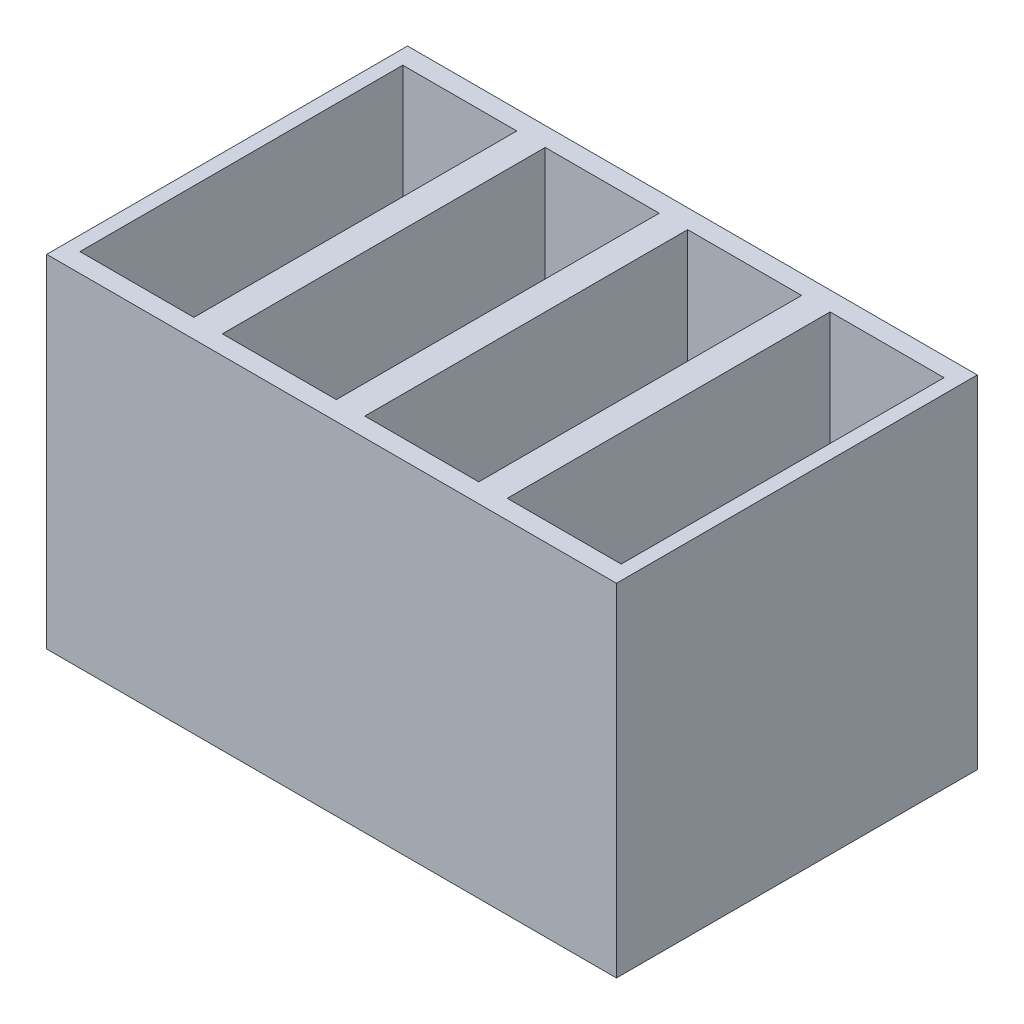
ISO-10303-21;
HEADER;
FILE_DESCRIPTION(('STEP AP214'),'2;1');
FILE_NAME('part.step','',(''),(''),'','','');
FILE_SCHEMA(('AUTOMOTIVE_DESIGN { 1 0 10303 214 1 1 1 1 }'));
ENDSEC;
DATA;
#1=APPLICATION_CONTEXT('core data for automotive mechanical design processes');
#2=APPLICATION_PROTOCOL_DEFINITION('international standard','automotive_design',2000,#1);
#3=PRODUCT_CONTEXT('',#1,'mechanical');
#4=PRODUCT('Part','Part','',(#3));
#5=PRODUCT_RELATED_PRODUCT_CATEGORY('part','',(#4));
#6=PRODUCT_DEFINITION_FORMATION('','',#4);
#7=PRODUCT_DEFINITION_CONTEXT('part definition',#1,'design');
#8=PRODUCT_DEFINITION('design','',#6,#7);
#9=PRODUCT_DEFINITION_SHAPE('','',#8);
#10=(LENGTH_UNIT() NAMED_UNIT(*) SI_UNIT(.MILLI.,.METRE.));
#11=(NAMED_UNIT(*) PLANE_ANGLE_UNIT() SI_UNIT($,.RADIAN.));
#12=(NAMED_UNIT(*) SI_UNIT($,.STERADIAN.) SOLID_ANGLE_UNIT());
#13=UNCERTAINTY_MEASURE_WITH_UNIT(LENGTH_MEASURE(1.E-05),#10,'distance_accuracy_value','');
#14=(GEOMETRIC_REPRESENTATION_CONTEXT(3) GLOBAL_UNCERTAINTY_ASSIGNED_CONTEXT((#13)) GLOBAL_UNIT_ASSIGNED_CONTEXT((#10,
#11,#12)) REPRESENTATION_CONTEXT('',''));
#15=CARTESIAN_POINT('',(0.,0.,0.));
#16=DIRECTION('',(0.,0.,1.));
#17=DIRECTION('',(1.,0.,0.));
#18=AXIS2_PLACEMENT_3D('',#15,#16,#17);
#19=CARTESIAN_POINT('',(0.,914.4,0.));
#20=DIRECTION('',(0.,1.,0.));
#21=DIRECTION('',(0.,0.,-1.));
#22=AXIS2_PLACEMENT_3D('',#19,#20,#21);
#23=PLANE('',#22);
#24=DIRECTION('',(0.,0.,-1.));
#25=VECTOR('',#24,1.);
#26=CARTESIAN_POINT('',(-1828.8,914.4,482.6));
#27=LINE('',#26,#25);
#28=CARTESIAN_POINT('',(-1828.8,914.4,482.6));
#29=VERTEX_POINT('',#28);
#30=CARTESIAN_POINT('',(-1828.8,914.4,-482.6));
#31=VERTEX_POINT('',#30);
#32=EDGE_CURVE('E304',#29,#31,#27,.T.);
#33=ORIENTED_EDGE('',*,*,#32,.F.);
#34=DIRECTION('',(-1.,0.,0.));
#35=VECTOR('',#34,1.);
#36=CARTESIAN_POINT('',(-1828.8,914.4,482.6));
#37=LINE('',#36,#35);
#38=CARTESIAN_POINT('',(-304.8,914.4,482.6));
#39=VERTEX_POINT('',#38);
#40=EDGE_CURVE('E314',#39,#29,#37,.T.);
#41=ORIENTED_EDGE('',*,*,#40,.F.);
#42=DIRECTION('',(0.,0.,1.));
#43=VECTOR('',#42,1.);
#44=CARTESIAN_POINT('',(-304.8,914.4,482.6));
#45=LINE('',#44,#43);
#46=CARTESIAN_POINT('',(-304.8,914.4,-482.6));
#47=VERTEX_POINT('',#46);
#48=EDGE_CURVE('E311',#47,#39,#45,.T.);
#49=ORIENTED_EDGE('',*,*,#48,.F.);
#50=DIRECTION('',(1.,0.,0.));
#51=VECTOR('',#50,1.);
#52=CARTESIAN_POINT('',(-1828.8,914.4,-482.6));
#53=LINE('',#52,#51);
#54=EDGE_CURVE('E307',#31,#47,#53,.T.);
#55=ORIENTED_EDGE('',*,*,#54,.F.);
#56=EDGE_LOOP('',(#33,#41,#49,#55));
#57=FACE_BOUND('',#56,.T.);
#58=DIRECTION('',(1.,0.,0.));
#59=VECTOR('',#58,1.);
#60=CARTESIAN_POINT('',(-1790.7,914.4,-431.8));
#61=LINE('',#60,#59);
#62=CARTESIAN_POINT('',(-1790.7,914.4,-431.8));
#63=VERTEX_POINT('',#62);
#64=CARTESIAN_POINT('',(-1485.9,914.4,-431.8));
#65=VERTEX_POINT('',#64);
#66=EDGE_CURVE('E275',#63,#65,#61,.T.);
#67=ORIENTED_EDGE('',*,*,#66,.T.);
#68=DIRECTION('',(0.,0.,1.));
#69=VECTOR('',#68,1.);
#70=CARTESIAN_POINT('',(-1485.9,914.4,431.8));
#71=LINE('',#70,#69);
#72=CARTESIAN_POINT('',(-1485.9,914.4,431.8));
#73=VERTEX_POINT('',#72);
#74=EDGE_CURVE('E279',#65,#73,#71,.T.);
#75=ORIENTED_EDGE('',*,*,#74,.T.);
#76=DIRECTION('',(-1.,0.,0.));
#77=VECTOR('',#76,1.);
#78=CARTESIAN_POINT('',(-1790.7,914.4,431.8));
#79=LINE('',#78,#77);
#80=CARTESIAN_POINT('',(-1790.7,914.4,431.8));
#81=VERTEX_POINT('',#80);
#82=EDGE_CURVE('E282',#73,#81,#79,.T.);
#83=ORIENTED_EDGE('',*,*,#82,.T.);
#84=DIRECTION('',(0.,0.,-1.));
#85=VECTOR('',#84,1.);
#86=CARTESIAN_POINT('',(-1790.7,914.4,431.8));
#87=LINE('',#86,#85);
#88=EDGE_CURVE('E272',#81,#63,#87,.T.);
#89=ORIENTED_EDGE('',*,*,#88,.T.);
#90=EDGE_LOOP('',(#67,#75,#83,#89));
#91=FACE_BOUND('',#90,.T.);
#92=DIRECTION('',(0.,0.,-1.));
#93=VECTOR('',#92,1.);
#94=CARTESIAN_POINT('',(-1409.7,914.4,431.8));
#95=LINE('',#94,#93);
#96=CARTESIAN_POINT('',(-1409.7,914.4,431.8));
#97=VERTEX_POINT('',#96);
#98=CARTESIAN_POINT('',(-1409.7,914.4,-431.8));
#99=VERTEX_POINT('',#98);
#100=EDGE_CURVE('E243',#97,#99,#95,.T.);
#101=ORIENTED_EDGE('',*,*,#100,.T.);
#102=DIRECTION('',(1.,0.,0.));
#103=VECTOR('',#102,1.);
#104=CARTESIAN_POINT('',(-1409.7,914.4,-431.8));
#105=LINE('',#104,#103);
#106=CARTESIAN_POINT('',(-1104.9,914.4,-431.8));
#107=VERTEX_POINT('',#106);
#108=EDGE_CURVE('E247',#99,#107,#105,.T.);
#109=ORIENTED_EDGE('',*,*,#108,.T.);
#110=DIRECTION('',(0.,0.,1.));
#111=VECTOR('',#110,1.);
#112=CARTESIAN_POINT('',(-1104.9,914.4,431.8));
#113=LINE('',#112,#111);
#114=CARTESIAN_POINT('',(-1104.9,914.4,431.8));
#115=VERTEX_POINT('',#114);
#116=EDGE_CURVE('E250',#107,#115,#113,.T.);
#117=ORIENTED_EDGE('',*,*,#116,.T.);
#118=DIRECTION('',(-1.,0.,0.));
#119=VECTOR('',#118,1.);
#120=CARTESIAN_POINT('',(-1409.7,914.4,431.8));
#121=LINE('',#120,#119);
#122=EDGE_CURVE('E240',#115,#97,#121,.T.);
#123=ORIENTED_EDGE('',*,*,#122,.T.);
#124=EDGE_LOOP('',(#101,#109,#117,#123));
#125=FACE_BOUND('',#124,.T.);
#126=DIRECTION('',(0.,0.,-1.));
#127=VECTOR('',#126,1.);
#128=CARTESIAN_POINT('',(-1028.7,914.4,431.8));
#129=LINE('',#128,#127);
#130=CARTESIAN_POINT('',(-1028.7,914.4,431.8));
#131=VERTEX_POINT('',#130);
#132=CARTESIAN_POINT('',(-1028.7,914.4,-431.8));
#133=VERTEX_POINT('',#132);
#134=EDGE_CURVE('E211',#131,#133,#129,.T.);
#135=ORIENTED_EDGE('',*,*,#134,.T.);
#136=DIRECTION('',(1.,0.,0.));
#137=VECTOR('',#136,1.);
#138=CARTESIAN_POINT('',(-1028.7,914.4,-431.8));
#139=LINE('',#138,#137);
#140=CARTESIAN_POINT('',(-723.9,914.4,-431.8));
#141=VERTEX_POINT('',#140);
#142=EDGE_CURVE('E215',#133,#141,#139,.T.);
#143=ORIENTED_EDGE('',*,*,#142,.T.);
#144=DIRECTION('',(0.,0.,1.));
#145=VECTOR('',#144,1.);
#146=CARTESIAN_POINT('',(-723.9,914.4,431.8));
#147=LINE('',#146,#145);
#148=CARTESIAN_POINT('',(-723.9,914.4,431.8));
#149=VERTEX_POINT('',#148);
#150=EDGE_CURVE('E218',#141,#149,#147,.T.);
#151=ORIENTED_EDGE('',*,*,#150,.T.);
#152=DIRECTION('',(-1.,0.,0.));
#153=VECTOR('',#152,1.);
#154=CARTESIAN_POINT('',(-1028.7,914.4,431.8));
#155=LINE('',#154,#153);
#156=EDGE_CURVE('E208',#149,#131,#155,.T.);
#157=ORIENTED_EDGE('',*,*,#156,.T.);
#158=EDGE_LOOP('',(#135,#143,#151,#157));
#159=FACE_BOUND('',#158,.T.);
#160=DIRECTION('',(0.,0.,-1.));
#161=VECTOR('',#160,1.);
#162=CARTESIAN_POINT('',(-647.7,914.4,431.8));
#163=LINE('',#162,#161);
#164=CARTESIAN_POINT('',(-647.7,914.4,431.8));
#165=VERTEX_POINT('',#164);
#166=CARTESIAN_POINT('',(-647.7,914.4,-431.8));
#167=VERTEX_POINT('',#166);
#168=EDGE_CURVE('E189',#165,#167,#163,.T.);
#169=ORIENTED_EDGE('',*,*,#168,.T.);
#170=DIRECTION('',(1.,0.,0.));
#171=VECTOR('',#170,1.);
#172=CARTESIAN_POINT('',(-647.7,914.4,-431.8));
#173=LINE('',#172,#171);
#174=CARTESIAN_POINT('',(-342.9,914.4,-431.8));
#175=VERTEX_POINT('',#174);
#176=EDGE_CURVE('E194',#167,#175,#173,.T.);
#177=ORIENTED_EDGE('',*,*,#176,.T.);
#178=DIRECTION('',(0.,0.,1.));
#179=VECTOR('',#178,1.);
#180=CARTESIAN_POINT('',(-342.9,914.4,431.8));
#181=LINE('',#180,#179);
#182=CARTESIAN_POINT('',(-342.9,914.4,431.8));
#183=VERTEX_POINT('',#182);
#184=EDGE_CURVE('E190',#175,#183,#181,.T.);
#185=ORIENTED_EDGE('',*,*,#184,.T.);
#186=DIRECTION('',(-1.,0.,0.));
#187=VECTOR('',#186,1.);
#188=CARTESIAN_POINT('',(-647.7,914.4,431.8));
#189=LINE('',#188,#187);
#190=EDGE_CURVE('E175',#183,#165,#189,.T.);
#191=ORIENTED_EDGE('',*,*,#190,.T.);
#192=EDGE_LOOP('',(#169,#177,#185,#191));
#193=FACE_BOUND('',#192,.T.);
#194=ADVANCED_FACE('F37',(#57,#91,#125,#159,#193),#23,.T.);
#195=CARTESIAN_POINT('',(0.,0.,0.));
#196=DIRECTION('',(0.,1.,0.));
#197=DIRECTION('',(0.,0.,-1.));
#198=AXIS2_PLACEMENT_3D('',#195,#196,#197);
#199=PLANE('',#198);
#200=DIRECTION('',(-1.,0.,0.));
#201=VECTOR('',#200,1.);
#202=CARTESIAN_POINT('',(-1028.7,0.,431.8));
#203=LINE('',#202,#201);
#204=CARTESIAN_POINT('',(-723.9,0.,431.8));
#205=VERTEX_POINT('',#204);
#206=CARTESIAN_POINT('',(-1028.7,0.,431.8));
#207=VERTEX_POINT('',#206);
#208=EDGE_CURVE('E183',#205,#207,#203,.T.);
#209=ORIENTED_EDGE('',*,*,#208,.F.);
#210=DIRECTION('',(0.,0.,1.));
#211=VECTOR('',#210,1.);
#212=CARTESIAN_POINT('',(-723.9,0.,431.8));
#213=LINE('',#212,#211);
#214=CARTESIAN_POINT('',(-723.9,0.,-431.8));
#215=VERTEX_POINT('',#214);
#216=EDGE_CURVE('E212',#215,#205,#213,.T.);
#217=ORIENTED_EDGE('',*,*,#216,.F.);
#218=DIRECTION('',(1.,0.,0.));
#219=VECTOR('',#218,1.);
#220=CARTESIAN_POINT('',(-1028.7,0.,-431.8));
#221=LINE('',#220,#219);
#222=CARTESIAN_POINT('',(-1028.7,0.,-431.8));
#223=VERTEX_POINT('',#222);
#224=EDGE_CURVE('E227',#223,#215,#221,.T.);
#225=ORIENTED_EDGE('',*,*,#224,.F.);
#226=DIRECTION('',(0.,0.,-1.));
#227=VECTOR('',#226,1.);
#228=CARTESIAN_POINT('',(-1028.7,0.,431.8));
#229=LINE('',#228,#227);
#230=EDGE_CURVE('E224',#207,#223,#229,.T.);
#231=ORIENTED_EDGE('',*,*,#230,.F.);
#232=EDGE_LOOP('',(#209,#217,#225,#231));
#233=FACE_BOUND('',#232,.T.);
#234=DIRECTION('',(0.,0.,-1.));
#235=VECTOR('',#234,1.);
#236=CARTESIAN_POINT('',(-1790.7,0.,431.8));
#237=LINE('',#236,#235);
#238=CARTESIAN_POINT('',(-1790.7,0.,431.8));
#239=VERTEX_POINT('',#238);
#240=CARTESIAN_POINT('',(-1790.7,0.,-431.8));
#241=VERTEX_POINT('',#240);
#242=EDGE_CURVE('E271',#239,#241,#237,.T.);
#243=ORIENTED_EDGE('',*,*,#242,.F.);
#244=DIRECTION('',(-1.,0.,0.));
#245=VECTOR('',#244,1.);
#246=CARTESIAN_POINT('',(-1790.7,0.,431.8));
#247=LINE('',#246,#245);
#248=CARTESIAN_POINT('',(-1485.9,0.,431.8));
#249=VERTEX_POINT('',#248);
#250=EDGE_CURVE('E276',#249,#239,#247,.T.);
#251=ORIENTED_EDGE('',*,*,#250,.F.);
#252=DIRECTION('',(0.,0.,1.));
#253=VECTOR('',#252,1.);
#254=CARTESIAN_POINT('',(-1485.9,0.,431.8));
#255=LINE('',#254,#253);
#256=CARTESIAN_POINT('',(-1485.9,0.,-431.8));
#257=VERTEX_POINT('',#256);
#258=EDGE_CURVE('E291',#257,#249,#255,.T.);
#259=ORIENTED_EDGE('',*,*,#258,.F.);
#260=DIRECTION('',(1.,0.,0.));
#261=VECTOR('',#260,1.);
#262=CARTESIAN_POINT('',(-1790.7,0.,-431.8));
#263=LINE('',#262,#261);
#264=EDGE_CURVE('E288',#241,#257,#263,.T.);
#265=ORIENTED_EDGE('',*,*,#264,.F.);
#266=EDGE_LOOP('',(#243,#251,#259,#265));
#267=FACE_BOUND('',#266,.T.);
#268=DIRECTION('',(0.,0.,-1.));
#269=VECTOR('',#268,1.);
#270=CARTESIAN_POINT('',(-1828.8,0.,482.6));
#271=LINE('',#270,#269);
#272=CARTESIAN_POINT('',(-1828.8,0.,482.6));
#273=VERTEX_POINT('',#272);
#274=CARTESIAN_POINT('',(-1828.8,0.,-482.6));
#275=VERTEX_POINT('',#274);
#276=EDGE_CURVE('E303',#273,#275,#271,.T.);
#277=ORIENTED_EDGE('',*,*,#276,.T.);
#278=DIRECTION('',(1.,0.,0.));
#279=VECTOR('',#278,1.);
#280=CARTESIAN_POINT('',(-1828.8,0.,-482.6));
#281=LINE('',#280,#279);
#282=CARTESIAN_POINT('',(-304.8,0.,-482.6));
#283=VERTEX_POINT('',#282);
#284=EDGE_CURVE('E320',#275,#283,#281,.T.);
#285=ORIENTED_EDGE('',*,*,#284,.T.);
#286=DIRECTION('',(0.,0.,1.));
#287=VECTOR('',#286,1.);
#288=CARTESIAN_POINT('',(-304.8,0.,482.6));
#289=LINE('',#288,#287);
#290=CARTESIAN_POINT('',(-304.8,0.,482.6));
#291=VERTEX_POINT('',#290);
#292=EDGE_CURVE('E323',#283,#291,#289,.T.);
#293=ORIENTED_EDGE('',*,*,#292,.T.);
#294=DIRECTION('',(-1.,0.,0.));
#295=VECTOR('',#294,1.);
#296=CARTESIAN_POINT('',(-1828.8,0.,482.6));
#297=LINE('',#296,#295);
#298=EDGE_CURVE('E308',#291,#273,#297,.T.);
#299=ORIENTED_EDGE('',*,*,#298,.T.);
#300=EDGE_LOOP('',(#277,#285,#293,#299));
#301=FACE_BOUND('',#300,.T.);
#302=DIRECTION('',(-1.,0.,0.));
#303=VECTOR('',#302,1.);
#304=CARTESIAN_POINT('',(-1409.7,0.,431.8));
#305=LINE('',#304,#303);
#306=CARTESIAN_POINT('',(-1104.9,0.,431.8));
#307=VERTEX_POINT('',#306);
#308=CARTESIAN_POINT('',(-1409.7,0.,431.8));
#309=VERTEX_POINT('',#308);
#310=EDGE_CURVE('E239',#307,#309,#305,.T.);
#311=ORIENTED_EDGE('',*,*,#310,.F.);
#312=DIRECTION('',(0.,0.,1.));
#313=VECTOR('',#312,1.);
#314=CARTESIAN_POINT('',(-1104.9,0.,431.8));
#315=LINE('',#314,#313);
#316=CARTESIAN_POINT('',(-1104.9,0.,-431.8));
#317=VERTEX_POINT('',#316);
#318=EDGE_CURVE('E244',#317,#307,#315,.T.);
#319=ORIENTED_EDGE('',*,*,#318,.F.);
#320=DIRECTION('',(1.,0.,0.));
#321=VECTOR('',#320,1.);
#322=CARTESIAN_POINT('',(-1409.7,0.,-431.8));
#323=LINE('',#322,#321);
#324=CARTESIAN_POINT('',(-1409.7,0.,-431.8));
#325=VERTEX_POINT('',#324);
#326=EDGE_CURVE('E259',#325,#317,#323,.T.);
#327=ORIENTED_EDGE('',*,*,#326,.F.);
#328=DIRECTION('',(0.,0.,-1.));
#329=VECTOR('',#328,1.);
#330=CARTESIAN_POINT('',(-1409.7,0.,431.8));
#331=LINE('',#330,#329);
#332=EDGE_CURVE('E256',#309,#325,#331,.T.);
#333=ORIENTED_EDGE('',*,*,#332,.F.);
#334=EDGE_LOOP('',(#311,#319,#327,#333));
#335=FACE_BOUND('',#334,.T.);
#336=DIRECTION('',(-1.,0.,0.));
#337=VECTOR('',#336,1.);
#338=CARTESIAN_POINT('',(-647.7,0.,431.8));
#339=LINE('',#338,#337);
#340=CARTESIAN_POINT('',(-342.9,0.,431.8));
#341=VERTEX_POINT('',#340);
#342=CARTESIAN_POINT('',(-647.7,0.,431.8));
#343=VERTEX_POINT('',#342);
#344=EDGE_CURVE('E178',#341,#343,#339,.T.);
#345=ORIENTED_EDGE('',*,*,#344,.F.);
#346=DIRECTION('',(0.,0.,1.));
#347=VECTOR('',#346,1.);
#348=CARTESIAN_POINT('',(-342.9,0.,431.8));
#349=LINE('',#348,#347);
#350=CARTESIAN_POINT('',(-342.9,0.,-431.8));
#351=VERTEX_POINT('',#350);
#352=EDGE_CURVE('E191',#351,#341,#349,.T.);
#353=ORIENTED_EDGE('',*,*,#352,.F.);
#354=DIRECTION('',(1.,0.,0.));
#355=VECTOR('',#354,1.);
#356=CARTESIAN_POINT('',(-647.7,0.,-431.8));
#357=LINE('',#356,#355);
#358=CARTESIAN_POINT('',(-647.7,0.,-431.8));
#359=VERTEX_POINT('',#358);
#360=EDGE_CURVE('E202',#359,#351,#357,.T.);
#361=ORIENTED_EDGE('',*,*,#360,.F.);
#362=DIRECTION('',(0.,0.,-1.));
#363=VECTOR('',#362,1.);
#364=CARTESIAN_POINT('',(-647.7,0.,431.8));
#365=LINE('',#364,#363);
#366=EDGE_CURVE('E200',#343,#359,#365,.T.);
#367=ORIENTED_EDGE('',*,*,#366,.F.);
#368=EDGE_LOOP('',(#345,#353,#361,#367));
#369=FACE_BOUND('',#368,.T.);
#370=ADVANCED_FACE('F340',(#233,#267,#301,#335,#369),#199,.F.);
#371=CARTESIAN_POINT('',(-1828.8,914.4,482.6));
#372=DIRECTION('',(1.,0.,0.));
#373=DIRECTION('',(0.,0.,1.));
#374=AXIS2_PLACEMENT_3D('',#371,#372,#373);
#375=PLANE('',#374);
#376=ORIENTED_EDGE('',*,*,#276,.F.);
#377=DIRECTION('',(0.,-1.,0.));
#378=VECTOR('',#377,1.);
#379=CARTESIAN_POINT('',(-1828.8,914.4,482.6));
#380=LINE('',#379,#378);
#381=EDGE_CURVE('E317',#29,#273,#380,.T.);
#382=ORIENTED_EDGE('',*,*,#381,.F.);
#383=ORIENTED_EDGE('',*,*,#32,.T.);
#384=DIRECTION('',(0.,-1.,0.));
#385=VECTOR('',#384,1.);
#386=CARTESIAN_POINT('',(-1828.8,914.4,-482.6));
#387=LINE('',#386,#385);
#388=EDGE_CURVE('E11',#31,#275,#387,.T.);
#389=ORIENTED_EDGE('',*,*,#388,.T.);
#390=EDGE_LOOP('',(#376,#382,#383,#389));
#391=FACE_BOUND('',#390,.T.);
#392=ADVANCED_FACE('F39',(#391),#375,.F.);
#393=CARTESIAN_POINT('',(-1828.8,914.4,-482.6));
#394=DIRECTION('',(0.,0.,1.));
#395=DIRECTION('',(-1.,0.,0.));
#396=AXIS2_PLACEMENT_3D('',#393,#394,#395);
#397=PLANE('',#396);
#398=ORIENTED_EDGE('',*,*,#284,.F.);
#399=ORIENTED_EDGE('',*,*,#388,.F.);
#400=ORIENTED_EDGE('',*,*,#54,.T.);
#401=DIRECTION('',(0.,-1.,0.));
#402=VECTOR('',#401,1.);
#403=CARTESIAN_POINT('',(-304.8,914.4,-482.6));
#404=LINE('',#403,#402);
#405=EDGE_CURVE('E45',#47,#283,#404,.T.);
#406=ORIENTED_EDGE('',*,*,#405,.T.);
#407=EDGE_LOOP('',(#398,#399,#400,#406));
#408=FACE_BOUND('',#407,.T.);
#409=ADVANCED_FACE('F333',(#408),#397,.F.);
#410=CARTESIAN_POINT('',(-304.8,914.4,482.6));
#411=DIRECTION('',(-1.,0.,0.));
#412=DIRECTION('',(0.,0.,-1.));
#413=AXIS2_PLACEMENT_3D('',#410,#411,#412);
#414=PLANE('',#413);
#415=ORIENTED_EDGE('',*,*,#292,.F.);
#416=ORIENTED_EDGE('',*,*,#405,.F.);
#417=ORIENTED_EDGE('',*,*,#48,.T.);
#418=DIRECTION('',(0.,-1.,0.));
#419=VECTOR('',#418,1.);
#420=CARTESIAN_POINT('',(-304.8,914.4,482.6));
#421=LINE('',#420,#419);
#422=EDGE_CURVE('E329',#39,#291,#421,.T.);
#423=ORIENTED_EDGE('',*,*,#422,.T.);
#424=EDGE_LOOP('',(#415,#416,#417,#423));
#425=FACE_BOUND('',#424,.T.);
#426=ADVANCED_FACE('F337',(#425),#414,.F.);
#427=CARTESIAN_POINT('',(-1828.8,914.4,482.6));
#428=DIRECTION('',(0.,0.,-1.));
#429=DIRECTION('',(1.,0.,0.));
#430=AXIS2_PLACEMENT_3D('',#427,#428,#429);
#431=PLANE('',#430);
#432=ORIENTED_EDGE('',*,*,#298,.F.);
#433=ORIENTED_EDGE('',*,*,#422,.F.);
#434=ORIENTED_EDGE('',*,*,#40,.T.);
#435=ORIENTED_EDGE('',*,*,#381,.T.);
#436=EDGE_LOOP('',(#432,#433,#434,#435));
#437=FACE_BOUND('',#436,.T.);
#438=ADVANCED_FACE('F349',(#437),#431,.F.);
#439=CARTESIAN_POINT('',(-1790.7,914.4,431.8));
#440=DIRECTION('',(1.,0.,0.));
#441=DIRECTION('',(0.,0.,1.));
#442=AXIS2_PLACEMENT_3D('',#439,#440,#441);
#443=PLANE('',#442);
#444=ORIENTED_EDGE('',*,*,#242,.T.);
#445=DIRECTION('',(0.,-1.,0.));
#446=VECTOR('',#445,1.);
#447=CARTESIAN_POINT('',(-1790.7,914.4,-431.8));
#448=LINE('',#447,#446);
#449=EDGE_CURVE('E301',#63,#241,#448,.T.);
#450=ORIENTED_EDGE('',*,*,#449,.F.);
#451=ORIENTED_EDGE('',*,*,#88,.F.);
#452=DIRECTION('',(0.,-1.,0.));
#453=VECTOR('',#452,1.);
#454=CARTESIAN_POINT('',(-1790.7,914.4,431.8));
#455=LINE('',#454,#453);
#456=EDGE_CURVE('E285',#81,#239,#455,.T.);
#457=ORIENTED_EDGE('',*,*,#456,.T.);
#458=EDGE_LOOP('',(#444,#450,#451,#457));
#459=FACE_BOUND('',#458,.T.);
#460=ADVANCED_FACE('F351',(#459),#443,.T.);
#461=CARTESIAN_POINT('',(-1790.7,914.4,-431.8));
#462=DIRECTION('',(0.,0.,1.));
#463=DIRECTION('',(-1.,0.,0.));
#464=AXIS2_PLACEMENT_3D('',#461,#462,#463);
#465=PLANE('',#464);
#466=ORIENTED_EDGE('',*,*,#264,.T.);
#467=DIRECTION('',(0.,-1.,0.));
#468=VECTOR('',#467,1.);
#469=CARTESIAN_POINT('',(-1485.9,914.4,-431.8));
#470=LINE('',#469,#468);
#471=EDGE_CURVE('E299',#65,#257,#470,.T.);
#472=ORIENTED_EDGE('',*,*,#471,.F.);
#473=ORIENTED_EDGE('',*,*,#66,.F.);
#474=ORIENTED_EDGE('',*,*,#449,.T.);
#475=EDGE_LOOP('',(#466,#472,#473,#474));
#476=FACE_BOUND('',#475,.T.);
#477=ADVANCED_FACE('F357',(#476),#465,.T.);
#478=CARTESIAN_POINT('',(-1485.9,914.4,431.8));
#479=DIRECTION('',(-1.,0.,0.));
#480=DIRECTION('',(0.,0.,-1.));
#481=AXIS2_PLACEMENT_3D('',#478,#479,#480);
#482=PLANE('',#481);
#483=ORIENTED_EDGE('',*,*,#258,.T.);
#484=DIRECTION('',(0.,-1.,0.));
#485=VECTOR('',#484,1.);
#486=CARTESIAN_POINT('',(-1485.9,914.4,431.8));
#487=LINE('',#486,#485);
#488=EDGE_CURVE('E297',#73,#249,#487,.T.);
#489=ORIENTED_EDGE('',*,*,#488,.F.);
#490=ORIENTED_EDGE('',*,*,#74,.F.);
#491=ORIENTED_EDGE('',*,*,#471,.T.);
#492=EDGE_LOOP('',(#483,#489,#490,#491));
#493=FACE_BOUND('',#492,.T.);
#494=ADVANCED_FACE('F371',(#493),#482,.T.);
#495=CARTESIAN_POINT('',(-1790.7,914.4,431.8));
#496=DIRECTION('',(0.,0.,-1.));
#497=DIRECTION('',(1.,0.,0.));
#498=AXIS2_PLACEMENT_3D('',#495,#496,#497);
#499=PLANE('',#498);
#500=ORIENTED_EDGE('',*,*,#250,.T.);
#501=ORIENTED_EDGE('',*,*,#456,.F.);
#502=ORIENTED_EDGE('',*,*,#82,.F.);
#503=ORIENTED_EDGE('',*,*,#488,.T.);
#504=EDGE_LOOP('',(#500,#501,#502,#503));
#505=FACE_BOUND('',#504,.T.);
#506=ADVANCED_FACE('F375',(#505),#499,.T.);
#507=CARTESIAN_POINT('',(-1409.7,914.4,431.8));
#508=DIRECTION('',(0.,0.,-1.));
#509=DIRECTION('',(1.,0.,0.));
#510=AXIS2_PLACEMENT_3D('',#507,#508,#509);
#511=PLANE('',#510);
#512=ORIENTED_EDGE('',*,*,#310,.T.);
#513=DIRECTION('',(0.,-1.,0.));
#514=VECTOR('',#513,1.);
#515=CARTESIAN_POINT('',(-1409.7,914.4,431.8));
#516=LINE('',#515,#514);
#517=EDGE_CURVE('E269',#97,#309,#516,.T.);
#518=ORIENTED_EDGE('',*,*,#517,.F.);
#519=ORIENTED_EDGE('',*,*,#122,.F.);
#520=DIRECTION('',(0.,-1.,0.));
#521=VECTOR('',#520,1.);
#522=CARTESIAN_POINT('',(-1104.9,914.4,431.8));
#523=LINE('',#522,#521);
#524=EDGE_CURVE('E253',#115,#307,#523,.T.);
#525=ORIENTED_EDGE('',*,*,#524,.T.);
#526=EDGE_LOOP('',(#512,#518,#519,#525));
#527=FACE_BOUND('',#526,.T.);
#528=ADVANCED_FACE('F379',(#527),#511,.T.);
#529=CARTESIAN_POINT('',(-1409.7,914.4,431.8));
#530=DIRECTION('',(1.,0.,0.));
#531=DIRECTION('',(0.,0.,1.));
#532=AXIS2_PLACEMENT_3D('',#529,#530,#531);
#533=PLANE('',#532);
#534=ORIENTED_EDGE('',*,*,#332,.T.);
#535=DIRECTION('',(0.,-1.,0.));
#536=VECTOR('',#535,1.);
#537=CARTESIAN_POINT('',(-1409.7,914.4,-431.8));
#538=LINE('',#537,#536);
#539=EDGE_CURVE('E267',#99,#325,#538,.T.);
#540=ORIENTED_EDGE('',*,*,#539,.F.);
#541=ORIENTED_EDGE('',*,*,#100,.F.);
#542=ORIENTED_EDGE('',*,*,#517,.T.);
#543=EDGE_LOOP('',(#534,#540,#541,#542));
#544=FACE_BOUND('',#543,.T.);
#545=ADVANCED_FACE('F383',(#544),#533,.T.);
#546=CARTESIAN_POINT('',(-1409.7,914.4,-431.8));
#547=DIRECTION('',(0.,0.,1.));
#548=DIRECTION('',(-1.,0.,0.));
#549=AXIS2_PLACEMENT_3D('',#546,#547,#548);
#550=PLANE('',#549);
#551=ORIENTED_EDGE('',*,*,#326,.T.);
#552=DIRECTION('',(0.,-1.,0.));
#553=VECTOR('',#552,1.);
#554=CARTESIAN_POINT('',(-1104.9,914.4,-431.8));
#555=LINE('',#554,#553);
#556=EDGE_CURVE('E265',#107,#317,#555,.T.);
#557=ORIENTED_EDGE('',*,*,#556,.F.);
#558=ORIENTED_EDGE('',*,*,#108,.F.);
#559=ORIENTED_EDGE('',*,*,#539,.T.);
#560=EDGE_LOOP('',(#551,#557,#558,#559));
#561=FACE_BOUND('',#560,.T.);
#562=ADVANCED_FACE('F387',(#561),#550,.T.);
#563=CARTESIAN_POINT('',(-1104.9,914.4,431.8));
#564=DIRECTION('',(-1.,0.,0.));
#565=DIRECTION('',(0.,0.,-1.));
#566=AXIS2_PLACEMENT_3D('',#563,#564,#565);
#567=PLANE('',#566);
#568=ORIENTED_EDGE('',*,*,#318,.T.);
#569=ORIENTED_EDGE('',*,*,#524,.F.);
#570=ORIENTED_EDGE('',*,*,#116,.F.);
#571=ORIENTED_EDGE('',*,*,#556,.T.);
#572=EDGE_LOOP('',(#568,#569,#570,#571));
#573=FACE_BOUND('',#572,.T.);
#574=ADVANCED_FACE('F391',(#573),#567,.T.);
#575=CARTESIAN_POINT('',(-1028.7,914.4,431.8));
#576=DIRECTION('',(0.,0.,-1.));
#577=DIRECTION('',(1.,0.,0.));
#578=AXIS2_PLACEMENT_3D('',#575,#576,#577);
#579=PLANE('',#578);
#580=ORIENTED_EDGE('',*,*,#208,.T.);
#581=DIRECTION('',(0.,-1.,0.));
#582=VECTOR('',#581,1.);
#583=CARTESIAN_POINT('',(-1028.7,914.4,431.8));
#584=LINE('',#583,#582);
#585=EDGE_CURVE('E237',#131,#207,#584,.T.);
#586=ORIENTED_EDGE('',*,*,#585,.F.);
#587=ORIENTED_EDGE('',*,*,#156,.F.);
#588=DIRECTION('',(0.,-1.,0.));
#589=VECTOR('',#588,1.);
#590=CARTESIAN_POINT('',(-723.9,914.4,431.8));
#591=LINE('',#590,#589);
#592=EDGE_CURVE('E221',#149,#205,#591,.T.);
#593=ORIENTED_EDGE('',*,*,#592,.T.);
#594=EDGE_LOOP('',(#580,#586,#587,#593));
#595=FACE_BOUND('',#594,.T.);
#596=ADVANCED_FACE('F395',(#595),#579,.T.);
#597=CARTESIAN_POINT('',(-1028.7,914.4,431.8));
#598=DIRECTION('',(1.,0.,0.));
#599=DIRECTION('',(0.,0.,1.));
#600=AXIS2_PLACEMENT_3D('',#597,#598,#599);
#601=PLANE('',#600);
#602=ORIENTED_EDGE('',*,*,#230,.T.);
#603=DIRECTION('',(0.,-1.,0.));
#604=VECTOR('',#603,1.);
#605=CARTESIAN_POINT('',(-1028.7,914.4,-431.8));
#606=LINE('',#605,#604);
#607=EDGE_CURVE('E235',#133,#223,#606,.T.);
#608=ORIENTED_EDGE('',*,*,#607,.F.);
#609=ORIENTED_EDGE('',*,*,#134,.F.);
#610=ORIENTED_EDGE('',*,*,#585,.T.);
#611=EDGE_LOOP('',(#602,#608,#609,#610));
#612=FACE_BOUND('',#611,.T.);
#613=ADVANCED_FACE('F399',(#612),#601,.T.);
#614=CARTESIAN_POINT('',(-1028.7,914.4,-431.8));
#615=DIRECTION('',(0.,0.,1.));
#616=DIRECTION('',(-1.,0.,0.));
#617=AXIS2_PLACEMENT_3D('',#614,#615,#616);
#618=PLANE('',#617);
#619=ORIENTED_EDGE('',*,*,#224,.T.);
#620=DIRECTION('',(0.,-1.,0.));
#621=VECTOR('',#620,1.);
#622=CARTESIAN_POINT('',(-723.9,914.4,-431.8));
#623=LINE('',#622,#621);
#624=EDGE_CURVE('E233',#141,#215,#623,.T.);
#625=ORIENTED_EDGE('',*,*,#624,.F.);
#626=ORIENTED_EDGE('',*,*,#142,.F.);
#627=ORIENTED_EDGE('',*,*,#607,.T.);
#628=EDGE_LOOP('',(#619,#625,#626,#627));
#629=FACE_BOUND('',#628,.T.);
#630=ADVANCED_FACE('F403',(#629),#618,.T.);
#631=CARTESIAN_POINT('',(-723.9,914.4,431.8));
#632=DIRECTION('',(-1.,0.,0.));
#633=DIRECTION('',(0.,0.,-1.));
#634=AXIS2_PLACEMENT_3D('',#631,#632,#633);
#635=PLANE('',#634);
#636=ORIENTED_EDGE('',*,*,#216,.T.);
#637=ORIENTED_EDGE('',*,*,#592,.F.);
#638=ORIENTED_EDGE('',*,*,#150,.F.);
#639=ORIENTED_EDGE('',*,*,#624,.T.);
#640=EDGE_LOOP('',(#636,#637,#638,#639));
#641=FACE_BOUND('',#640,.T.);
#642=ADVANCED_FACE('F407',(#641),#635,.T.);
#643=CARTESIAN_POINT('',(-647.7,914.4,431.8));
#644=DIRECTION('',(0.,0.,-1.));
#645=DIRECTION('',(1.,0.,0.));
#646=AXIS2_PLACEMENT_3D('',#643,#644,#645);
#647=PLANE('',#646);
#648=ORIENTED_EDGE('',*,*,#344,.T.);
#649=DIRECTION('',(0.,-1.,0.));
#650=VECTOR('',#649,1.);
#651=CARTESIAN_POINT('',(-647.7,914.4,431.8));
#652=LINE('',#651,#650);
#653=EDGE_CURVE('E172',#165,#343,#652,.T.);
#654=ORIENTED_EDGE('',*,*,#653,.F.);
#655=ORIENTED_EDGE('',*,*,#190,.F.);
#656=DIRECTION('',(0.,-1.,0.));
#657=VECTOR('',#656,1.);
#658=CARTESIAN_POINT('',(-342.9,914.4,431.8));
#659=LINE('',#658,#657);
#660=EDGE_CURVE('E60',#183,#341,#659,.T.);
#661=ORIENTED_EDGE('',*,*,#660,.T.);
#662=EDGE_LOOP('',(#648,#654,#655,#661));
#663=FACE_BOUND('',#662,.T.);
#664=ADVANCED_FACE('F174',(#663),#647,.T.);
#665=CARTESIAN_POINT('',(-647.7,914.4,431.8));
#666=DIRECTION('',(1.,0.,0.));
#667=DIRECTION('',(0.,0.,1.));
#668=AXIS2_PLACEMENT_3D('',#665,#666,#667);
#669=PLANE('',#668);
#670=ORIENTED_EDGE('',*,*,#366,.T.);
#671=DIRECTION('',(0.,-1.,0.));
#672=VECTOR('',#671,1.);
#673=CARTESIAN_POINT('',(-647.7,914.4,-431.8));
#674=LINE('',#673,#672);
#675=EDGE_CURVE('E184',#167,#359,#674,.T.);
#676=ORIENTED_EDGE('',*,*,#675,.F.);
#677=ORIENTED_EDGE('',*,*,#168,.F.);
#678=ORIENTED_EDGE('',*,*,#653,.T.);
#679=EDGE_LOOP('',(#670,#676,#677,#678));
#680=FACE_BOUND('',#679,.T.);
#681=ADVANCED_FACE('F193',(#680),#669,.T.);
#682=CARTESIAN_POINT('',(-647.7,914.4,-431.8));
#683=DIRECTION('',(0.,0.,1.));
#684=DIRECTION('',(-1.,0.,0.));
#685=AXIS2_PLACEMENT_3D('',#682,#683,#684);
#686=PLANE('',#685);
#687=ORIENTED_EDGE('',*,*,#360,.T.);
#688=DIRECTION('',(0.,-1.,0.));
#689=VECTOR('',#688,1.);
#690=CARTESIAN_POINT('',(-342.9,914.4,-431.8));
#691=LINE('',#690,#689);
#692=EDGE_CURVE('E52',#175,#351,#691,.T.);
#693=ORIENTED_EDGE('',*,*,#692,.F.);
#694=ORIENTED_EDGE('',*,*,#176,.F.);
#695=ORIENTED_EDGE('',*,*,#675,.T.);
#696=EDGE_LOOP('',(#687,#693,#694,#695));
#697=FACE_BOUND('',#696,.T.);
#698=ADVANCED_FACE('F416',(#697),#686,.T.);
#699=CARTESIAN_POINT('',(-342.9,914.4,431.8));
#700=DIRECTION('',(-1.,0.,0.));
#701=DIRECTION('',(0.,0.,-1.));
#702=AXIS2_PLACEMENT_3D('',#699,#700,#701);
#703=PLANE('',#702);
#704=ORIENTED_EDGE('',*,*,#352,.T.);
#705=ORIENTED_EDGE('',*,*,#660,.F.);
#706=ORIENTED_EDGE('',*,*,#184,.F.);
#707=ORIENTED_EDGE('',*,*,#692,.T.);
#708=EDGE_LOOP('',(#704,#705,#706,#707));
#709=FACE_BOUND('',#708,.T.);
#710=ADVANCED_FACE('F419',(#709),#703,.T.);
#711=CLOSED_SHELL('',(#194,#370,#392,#409,#426,#438,#460,#477,#494,#506,#528,#545,#562,#574,
#596,#613,#630,#642,#664,#681,#698,#710));
#712=MANIFOLD_SOLID_BREP('B2',#711);
#713=ADVANCED_BREP_SHAPE_REPRESENTATION('',(#18,#712),#14);
#714=SHAPE_DEFINITION_REPRESENTATION(#9,#713);
ENDSEC;
END-ISO-10303-21;
